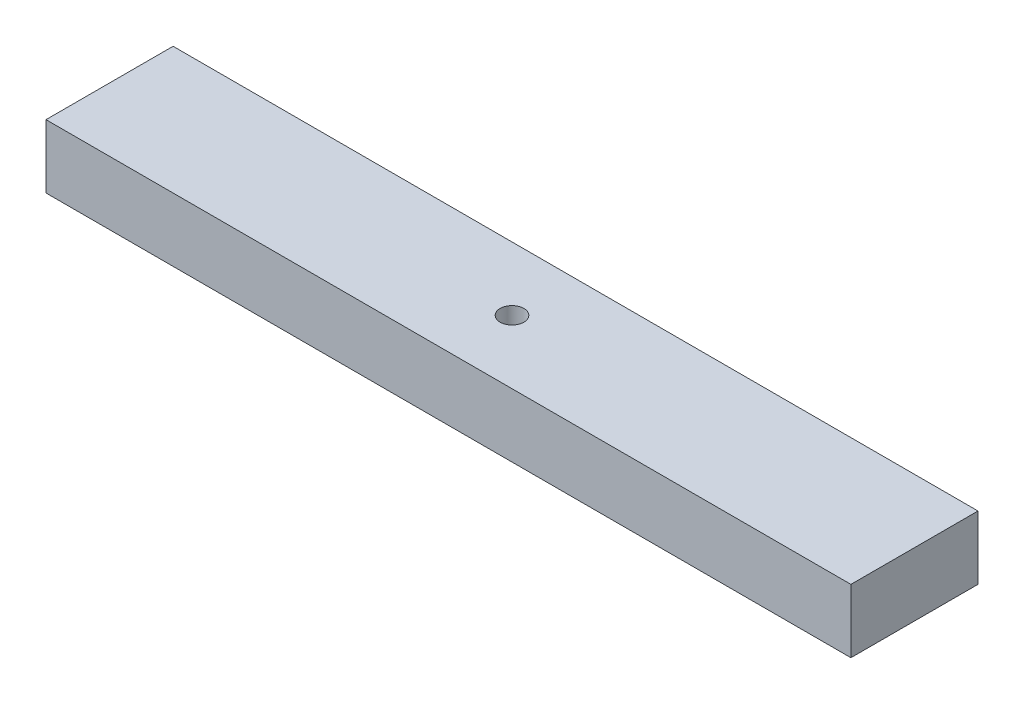
ISO-10303-21;
HEADER;
FILE_DESCRIPTION(('STEP AP214'),'2;1');
FILE_NAME('part.step','',(''),(''),'','','');
FILE_SCHEMA(('AUTOMOTIVE_DESIGN { 1 0 10303 214 1 1 1 1 }'));
ENDSEC;
DATA;
#1=APPLICATION_CONTEXT('core data for automotive mechanical design processes');
#2=APPLICATION_PROTOCOL_DEFINITION('international standard','automotive_design',2000,#1);
#3=PRODUCT_CONTEXT('',#1,'mechanical');
#4=PRODUCT('Part','Part','',(#3));
#5=PRODUCT_RELATED_PRODUCT_CATEGORY('part','',(#4));
#6=PRODUCT_DEFINITION_FORMATION('','',#4);
#7=PRODUCT_DEFINITION_CONTEXT('part definition',#1,'design');
#8=PRODUCT_DEFINITION('design','',#6,#7);
#9=PRODUCT_DEFINITION_SHAPE('','',#8);
#10=(LENGTH_UNIT() NAMED_UNIT(*) SI_UNIT(.MILLI.,.METRE.));
#11=(NAMED_UNIT(*) PLANE_ANGLE_UNIT() SI_UNIT($,.RADIAN.));
#12=(NAMED_UNIT(*) SI_UNIT($,.STERADIAN.) SOLID_ANGLE_UNIT());
#13=UNCERTAINTY_MEASURE_WITH_UNIT(LENGTH_MEASURE(1.E-05),#10,'distance_accuracy_value','');
#14=(GEOMETRIC_REPRESENTATION_CONTEXT(3) GLOBAL_UNCERTAINTY_ASSIGNED_CONTEXT((#13)) GLOBAL_UNIT_ASSIGNED_CONTEXT((#10,
#11,#12)) REPRESENTATION_CONTEXT('',''));
#15=CARTESIAN_POINT('',(0.,0.,0.));
#16=DIRECTION('',(0.,0.,1.));
#17=DIRECTION('',(1.,0.,0.));
#18=AXIS2_PLACEMENT_3D('',#15,#16,#17);
#19=CARTESIAN_POINT('',(0.,0.,0.));
#20=DIRECTION('',(0.,1.,0.));
#21=DIRECTION('',(0.,0.,1.));
#22=AXIS2_PLACEMENT_3D('',#19,#20,#21);
#23=CYLINDRICAL_SURFACE('',#22,4.5);
#24=CARTESIAN_POINT('',(0.,24.,1.66533453693773E-13));
#25=DIRECTION('',(0.,1.,0.));
#26=DIRECTION('',(0.,0.,1.));
#27=AXIS2_PLACEMENT_3D('',#24,#25,#26);
#28=CIRCLE('',#27,4.5);
#29=CARTESIAN_POINT('',(0.,24.,4.50000000000017));
#30=VERTEX_POINT('',#29);
#31=EDGE_CURVE('E121',#30,#30,#28,.T.);
#32=ORIENTED_EDGE('',*,*,#31,.T.);
#33=EDGE_LOOP('',(#32));
#34=FACE_BOUND('',#33,.T.);
#35=CARTESIAN_POINT('',(0.,12.,0.));
#36=DIRECTION('',(0.,-1.,0.));
#37=DIRECTION('',(0.,0.,-1.));
#38=AXIS2_PLACEMENT_3D('',#35,#36,#37);
#39=CIRCLE('',#38,4.5);
#40=CARTESIAN_POINT('',(0.,12.,-4.5));
#41=VERTEX_POINT('',#40);
#42=EDGE_CURVE('E49',#41,#41,#39,.F.);
#43=ORIENTED_EDGE('',*,*,#42,.F.);
#44=EDGE_LOOP('',(#43));
#45=FACE_BOUND('',#44,.T.);
#46=ADVANCED_FACE('F45',(#34,#45),#23,.F.);
#47=CARTESIAN_POINT('',(152.,24.,24.));
#48=DIRECTION('',(-1.,0.,0.));
#49=DIRECTION('',(0.,0.,1.));
#50=AXIS2_PLACEMENT_3D('',#47,#48,#49);
#51=PLANE('',#50);
#52=DIRECTION('',(0.,0.,-1.));
#53=VECTOR('',#52,1.);
#54=CARTESIAN_POINT('',(152.,0.,24.));
#55=LINE('',#54,#53);
#56=CARTESIAN_POINT('',(152.,0.,24.));
#57=VERTEX_POINT('',#56);
#58=CARTESIAN_POINT('',(152.,1.16573417585641E-12,-24.));
#59=VERTEX_POINT('',#58);
#60=EDGE_CURVE('E117',#57,#59,#55,.T.);
#61=ORIENTED_EDGE('',*,*,#60,.T.);
#62=DIRECTION('',(0.,-1.,0.));
#63=VECTOR('',#62,1.);
#64=CARTESIAN_POINT('',(152.,24.0000000000012,-24.));
#65=LINE('',#64,#63);
#66=CARTESIAN_POINT('',(152.,24.0000000000012,-24.));
#67=VERTEX_POINT('',#66);
#68=EDGE_CURVE('E11',#67,#59,#65,.T.);
#69=ORIENTED_EDGE('',*,*,#68,.F.);
#70=DIRECTION('',(0.,0.,-1.));
#71=VECTOR('',#70,1.);
#72=CARTESIAN_POINT('',(152.,24.,24.));
#73=LINE('',#72,#71);
#74=CARTESIAN_POINT('',(152.,24.,24.));
#75=VERTEX_POINT('',#74);
#76=EDGE_CURVE('E99',#75,#67,#73,.T.);
#77=ORIENTED_EDGE('',*,*,#76,.F.);
#78=DIRECTION('',(0.,-1.,0.));
#79=VECTOR('',#78,1.);
#80=CARTESIAN_POINT('',(152.,24.,24.));
#81=LINE('',#80,#79);
#82=EDGE_CURVE('E113',#75,#57,#81,.T.);
#83=ORIENTED_EDGE('',*,*,#82,.T.);
#84=EDGE_LOOP('',(#61,#69,#77,#83));
#85=FACE_BOUND('',#84,.T.);
#86=ADVANCED_FACE('F47',(#85),#51,.F.);
#87=CARTESIAN_POINT('',(-152.,24.0000000000012,-24.));
#88=DIRECTION('',(0.,0.,1.));
#89=DIRECTION('',(1.,0.,0.));
#90=AXIS2_PLACEMENT_3D('',#87,#88,#89);
#91=PLANE('',#90);
#92=DIRECTION('',(-1.,0.,0.));
#93=VECTOR('',#92,1.);
#94=CARTESIAN_POINT('',(-152.,1.16573417585641E-12,-24.));
#95=LINE('',#94,#93);
#96=CARTESIAN_POINT('',(-152.,1.16573417585641E-12,-24.));
#97=VERTEX_POINT('',#96);
#98=EDGE_CURVE('E104',#59,#97,#95,.T.);
#99=ORIENTED_EDGE('',*,*,#98,.T.);
#100=DIRECTION('',(0.,-1.,0.));
#101=VECTOR('',#100,1.);
#102=CARTESIAN_POINT('',(-152.,24.0000000000012,-24.));
#103=LINE('',#102,#101);
#104=CARTESIAN_POINT('',(-152.,24.0000000000012,-24.));
#105=VERTEX_POINT('',#104);
#106=EDGE_CURVE('E56',#105,#97,#103,.T.);
#107=ORIENTED_EDGE('',*,*,#106,.F.);
#108=DIRECTION('',(-1.,0.,0.));
#109=VECTOR('',#108,1.);
#110=CARTESIAN_POINT('',(-152.,24.0000000000012,-24.));
#111=LINE('',#110,#109);
#112=EDGE_CURVE('E94',#67,#105,#111,.T.);
#113=ORIENTED_EDGE('',*,*,#112,.F.);
#114=ORIENTED_EDGE('',*,*,#68,.T.);
#115=EDGE_LOOP('',(#99,#107,#113,#114));
#116=FACE_BOUND('',#115,.T.);
#117=ADVANCED_FACE('F103',(#116),#91,.F.);
#118=CARTESIAN_POINT('',(-152.,24.,24.));
#119=DIRECTION('',(1.,0.,0.));
#120=DIRECTION('',(0.,0.,-1.));
#121=AXIS2_PLACEMENT_3D('',#118,#119,#120);
#122=PLANE('',#121);
#123=DIRECTION('',(0.,0.,1.));
#124=VECTOR('',#123,1.);
#125=CARTESIAN_POINT('',(-152.,0.,24.));
#126=LINE('',#125,#124);
#127=CARTESIAN_POINT('',(-152.,0.,24.));
#128=VERTEX_POINT('',#127);
#129=EDGE_CURVE('E81',#97,#128,#126,.T.);
#130=ORIENTED_EDGE('',*,*,#129,.T.);
#131=DIRECTION('',(0.,-1.,0.));
#132=VECTOR('',#131,1.);
#133=CARTESIAN_POINT('',(-152.,24.,24.));
#134=LINE('',#133,#132);
#135=CARTESIAN_POINT('',(-152.,24.,24.));
#136=VERTEX_POINT('',#135);
#137=EDGE_CURVE('E106',#136,#128,#134,.T.);
#138=ORIENTED_EDGE('',*,*,#137,.F.);
#139=DIRECTION('',(0.,0.,1.));
#140=VECTOR('',#139,1.);
#141=CARTESIAN_POINT('',(-152.,24.,24.));
#142=LINE('',#141,#140);
#143=EDGE_CURVE('E97',#105,#136,#142,.T.);
#144=ORIENTED_EDGE('',*,*,#143,.F.);
#145=ORIENTED_EDGE('',*,*,#106,.T.);
#146=EDGE_LOOP('',(#130,#138,#144,#145));
#147=FACE_BOUND('',#146,.T.);
#148=ADVANCED_FACE('F108',(#147),#122,.F.);
#149=CARTESIAN_POINT('',(-152.,24.,24.));
#150=DIRECTION('',(0.,0.,-1.));
#151=DIRECTION('',(-1.,0.,0.));
#152=AXIS2_PLACEMENT_3D('',#149,#150,#151);
#153=PLANE('',#152);
#154=DIRECTION('',(1.,0.,0.));
#155=VECTOR('',#154,1.);
#156=CARTESIAN_POINT('',(-152.,0.,24.));
#157=LINE('',#156,#155);
#158=EDGE_CURVE('E87',#128,#57,#157,.T.);
#159=ORIENTED_EDGE('',*,*,#158,.T.);
#160=ORIENTED_EDGE('',*,*,#82,.F.);
#161=DIRECTION('',(1.,0.,0.));
#162=VECTOR('',#161,1.);
#163=CARTESIAN_POINT('',(-152.,24.,24.));
#164=LINE('',#163,#162);
#165=EDGE_CURVE('E64',#136,#75,#164,.T.);
#166=ORIENTED_EDGE('',*,*,#165,.F.);
#167=ORIENTED_EDGE('',*,*,#137,.T.);
#168=EDGE_LOOP('',(#159,#160,#166,#167));
#169=FACE_BOUND('',#168,.T.);
#170=ADVANCED_FACE('F132',(#169),#153,.F.);
#171=CARTESIAN_POINT('',(0.,24.,1.66533453693773E-13));
#172=DIRECTION('',(0.,-1.,0.));
#173=DIRECTION('',(0.,0.,-1.));
#174=AXIS2_PLACEMENT_3D('',#171,#172,#173);
#175=PLANE('',#174);
#176=ORIENTED_EDGE('',*,*,#31,.F.);
#177=EDGE_LOOP('',(#176));
#178=FACE_BOUND('',#177,.T.);
#179=ORIENTED_EDGE('',*,*,#76,.T.);
#180=ORIENTED_EDGE('',*,*,#112,.T.);
#181=ORIENTED_EDGE('',*,*,#143,.T.);
#182=ORIENTED_EDGE('',*,*,#165,.T.);
#183=EDGE_LOOP('',(#179,#180,#181,#182));
#184=FACE_BOUND('',#183,.T.);
#185=ADVANCED_FACE('F95',(#178,#184),#175,.F.);
#186=CARTESIAN_POINT('',(0.,0.,0.));
#187=DIRECTION('',(0.,-1.,0.));
#188=DIRECTION('',(0.,0.,-1.));
#189=AXIS2_PLACEMENT_3D('',#186,#187,#188);
#190=PLANE('',#189);
#191=CARTESIAN_POINT('',(0.,0.,0.));
#192=DIRECTION('',(0.,-1.,0.));
#193=DIRECTION('',(0.,0.,-1.));
#194=AXIS2_PLACEMENT_3D('',#191,#192,#193);
#195=CIRCLE('',#194,7.00000000000001);
#196=CARTESIAN_POINT('',(0.,0.,-7.00000000000001));
#197=VERTEX_POINT('',#196);
#198=EDGE_CURVE('E143',#197,#197,#195,.T.);
#199=ORIENTED_EDGE('',*,*,#198,.F.);
#200=EDGE_LOOP('',(#199));
#201=FACE_BOUND('',#200,.T.);
#202=ORIENTED_EDGE('',*,*,#60,.F.);
#203=ORIENTED_EDGE('',*,*,#158,.F.);
#204=ORIENTED_EDGE('',*,*,#129,.F.);
#205=ORIENTED_EDGE('',*,*,#98,.F.);
#206=EDGE_LOOP('',(#202,#203,#204,#205));
#207=FACE_BOUND('',#206,.T.);
#208=ADVANCED_FACE('F135',(#201,#207),#190,.T.);
#209=CARTESIAN_POINT('',(0.,12.,0.));
#210=DIRECTION('',(0.,-1.,0.));
#211=DIRECTION('',(0.,0.,-1.));
#212=AXIS2_PLACEMENT_3D('',#209,#210,#211);
#213=PLANE('',#212);
#214=CARTESIAN_POINT('',(0.,12.,0.));
#215=DIRECTION('',(0.,-1.,0.));
#216=DIRECTION('',(0.,0.,-1.));
#217=AXIS2_PLACEMENT_3D('',#214,#215,#216);
#218=CIRCLE('',#217,7.00000000000001);
#219=CARTESIAN_POINT('',(0.,12.,-7.00000000000001));
#220=VERTEX_POINT('',#219);
#221=EDGE_CURVE('E147',#220,#220,#218,.T.);
#222=ORIENTED_EDGE('',*,*,#221,.T.);
#223=EDGE_LOOP('',(#222));
#224=FACE_BOUND('',#223,.T.);
#225=ORIENTED_EDGE('',*,*,#42,.T.);
#226=EDGE_LOOP('',(#225));
#227=FACE_BOUND('',#226,.T.);
#228=ADVANCED_FACE('F158',(#224,#227),#213,.T.);
#229=CARTESIAN_POINT('',(0.,12.,0.));
#230=DIRECTION('',(0.,-1.,0.));
#231=DIRECTION('',(0.,0.,-1.));
#232=AXIS2_PLACEMENT_3D('',#229,#230,#231);
#233=CYLINDRICAL_SURFACE('',#232,7.00000000000001);
#234=ORIENTED_EDGE('',*,*,#221,.F.);
#235=EDGE_LOOP('',(#234));
#236=FACE_BOUND('',#235,.T.);
#237=ORIENTED_EDGE('',*,*,#198,.T.);
#238=EDGE_LOOP('',(#237));
#239=FACE_BOUND('',#238,.T.);
#240=ADVANCED_FACE('F168',(#236,#239),#233,.F.);
#241=CLOSED_SHELL('',(#46,#86,#117,#148,#170,#185,#208,#228,#240));
#242=MANIFOLD_SOLID_BREP('B2',#241);
#243=ADVANCED_BREP_SHAPE_REPRESENTATION('',(#18,#242),#14);
#244=SHAPE_DEFINITION_REPRESENTATION(#9,#243);
ENDSEC;
END-ISO-10303-21;
